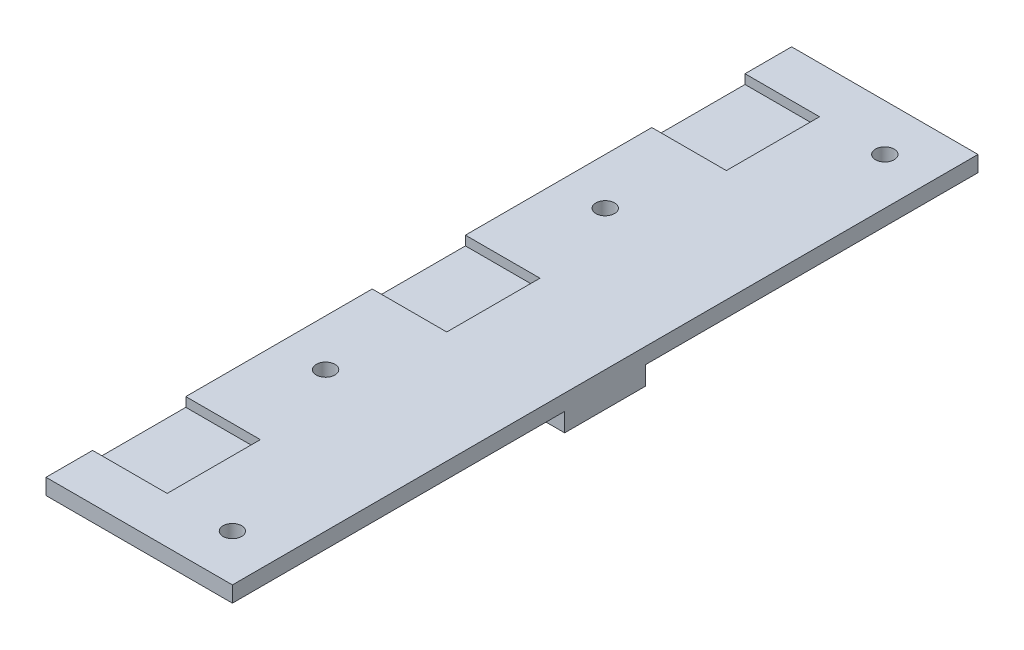
ISO-10303-21;
HEADER;
FILE_DESCRIPTION(('STEP AP214'),'2;1');
FILE_NAME('part.step','',(''),(''),'','','');
FILE_SCHEMA(('AUTOMOTIVE_DESIGN { 1 0 10303 214 1 1 1 1 }'));
ENDSEC;
DATA;
#1=APPLICATION_CONTEXT('core data for automotive mechanical design processes');
#2=APPLICATION_PROTOCOL_DEFINITION('international standard','automotive_design',2000,#1);
#3=PRODUCT_CONTEXT('',#1,'mechanical');
#4=PRODUCT('Part','Part','',(#3));
#5=PRODUCT_RELATED_PRODUCT_CATEGORY('part','',(#4));
#6=PRODUCT_DEFINITION_FORMATION('','',#4);
#7=PRODUCT_DEFINITION_CONTEXT('part definition',#1,'design');
#8=PRODUCT_DEFINITION('design','',#6,#7);
#9=PRODUCT_DEFINITION_SHAPE('','',#8);
#10=(LENGTH_UNIT() NAMED_UNIT(*) SI_UNIT(.MILLI.,.METRE.));
#11=(NAMED_UNIT(*) PLANE_ANGLE_UNIT() SI_UNIT($,.RADIAN.));
#12=(NAMED_UNIT(*) SI_UNIT($,.STERADIAN.) SOLID_ANGLE_UNIT());
#13=UNCERTAINTY_MEASURE_WITH_UNIT(LENGTH_MEASURE(1.E-05),#10,'distance_accuracy_value','');
#14=(GEOMETRIC_REPRESENTATION_CONTEXT(3) GLOBAL_UNCERTAINTY_ASSIGNED_CONTEXT((#13)) GLOBAL_UNIT_ASSIGNED_CONTEXT((#10,
#11,#12)) REPRESENTATION_CONTEXT('',''));
#15=CARTESIAN_POINT('',(0.,0.,0.));
#16=DIRECTION('',(0.,0.,1.));
#17=DIRECTION('',(1.,0.,0.));
#18=AXIS2_PLACEMENT_3D('',#15,#16,#17);
#19=CARTESIAN_POINT('',(0.,1.7,0.));
#20=DIRECTION('',(0.,-1.,0.));
#21=DIRECTION('',(0.,0.,-1.));
#22=AXIS2_PLACEMENT_3D('',#19,#20,#21);
#23=PLANE('',#22);
#24=DIRECTION('',(0.,0.,1.));
#25=VECTOR('',#24,1.);
#26=CARTESIAN_POINT('',(-10.,1.7,40.));
#27=LINE('',#26,#25);
#28=CARTESIAN_POINT('',(-10.,1.7,4.99999999999997));
#29=VERTEX_POINT('',#28);
#30=CARTESIAN_POINT('',(-10.,1.7,25.));
#31=VERTEX_POINT('',#30);
#32=EDGE_CURVE('E360',#29,#31,#27,.T.);
#33=ORIENTED_EDGE('',*,*,#32,.T.);
#34=DIRECTION('',(-1.,0.,0.));
#35=VECTOR('',#34,1.);
#36=CARTESIAN_POINT('',(-10.,1.7,25.));
#37=LINE('',#36,#35);
#38=CARTESIAN_POINT('',(-2.,1.7,25.));
#39=VERTEX_POINT('',#38);
#40=EDGE_CURVE('E212',#39,#31,#37,.T.);
#41=ORIENTED_EDGE('',*,*,#40,.F.);
#42=DIRECTION('',(0.,0.,-1.));
#43=VECTOR('',#42,1.);
#44=CARTESIAN_POINT('',(-2.,1.7,25.));
#45=LINE('',#44,#43);
#46=CARTESIAN_POINT('',(-2.,1.7,35.));
#47=VERTEX_POINT('',#46);
#48=EDGE_CURVE('E224',#47,#39,#45,.T.);
#49=ORIENTED_EDGE('',*,*,#48,.F.);
#50=DIRECTION('',(1.,0.,0.));
#51=VECTOR('',#50,1.);
#52=CARTESIAN_POINT('',(-10.,1.7,35.));
#53=LINE('',#52,#51);
#54=CARTESIAN_POINT('',(-10.,1.7,35.));
#55=VERTEX_POINT('',#54);
#56=EDGE_CURVE('E221',#55,#47,#53,.T.);
#57=ORIENTED_EDGE('',*,*,#56,.F.);
#58=CARTESIAN_POINT('',(-10.,1.7,40.));
#59=VERTEX_POINT('',#58);
#60=EDGE_CURVE('E318',#55,#59,#27,.T.);
#61=ORIENTED_EDGE('',*,*,#60,.T.);
#62=DIRECTION('',(1.,0.,0.));
#63=VECTOR('',#62,1.);
#64=CARTESIAN_POINT('',(-10.,1.7,40.));
#65=LINE('',#64,#63);
#66=CARTESIAN_POINT('',(9.99999999999999,1.7,40.));
#67=VERTEX_POINT('',#66);
#68=EDGE_CURVE('E322',#59,#67,#65,.T.);
#69=ORIENTED_EDGE('',*,*,#68,.T.);
#70=DIRECTION('',(0.,0.,-1.));
#71=VECTOR('',#70,1.);
#72=CARTESIAN_POINT('',(9.99999999999999,1.7,40.));
#73=LINE('',#72,#71);
#74=CARTESIAN_POINT('',(9.99999999999999,1.7,-40.));
#75=VERTEX_POINT('',#74);
#76=EDGE_CURVE('E312',#67,#75,#73,.T.);
#77=ORIENTED_EDGE('',*,*,#76,.T.);
#78=DIRECTION('',(-1.,0.,0.));
#79=VECTOR('',#78,1.);
#80=CARTESIAN_POINT('',(-10.,1.7,-40.));
#81=LINE('',#80,#79);
#82=CARTESIAN_POINT('',(-10.,1.7,-40.));
#83=VERTEX_POINT('',#82);
#84=EDGE_CURVE('E315',#75,#83,#81,.T.);
#85=ORIENTED_EDGE('',*,*,#84,.T.);
#86=CARTESIAN_POINT('',(-10.,1.7,-35.));
#87=VERTEX_POINT('',#86);
#88=EDGE_CURVE('E319',#83,#87,#27,.T.);
#89=ORIENTED_EDGE('',*,*,#88,.T.);
#90=DIRECTION('',(-1.,0.,0.));
#91=VECTOR('',#90,1.);
#92=CARTESIAN_POINT('',(-10.,1.7,-35.));
#93=LINE('',#92,#91);
#94=CARTESIAN_POINT('',(-2.00000000000001,1.7,-35.));
#95=VERTEX_POINT('',#94);
#96=EDGE_CURVE('E272',#95,#87,#93,.T.);
#97=ORIENTED_EDGE('',*,*,#96,.F.);
#98=DIRECTION('',(0.,0.,-1.));
#99=VECTOR('',#98,1.);
#100=CARTESIAN_POINT('',(-2.00000000000001,1.7,-35.));
#101=LINE('',#100,#99);
#102=CARTESIAN_POINT('',(-2.00000000000001,1.7,-25.));
#103=VERTEX_POINT('',#102);
#104=EDGE_CURVE('E274',#103,#95,#101,.T.);
#105=ORIENTED_EDGE('',*,*,#104,.F.);
#106=DIRECTION('',(1.,0.,0.));
#107=VECTOR('',#106,1.);
#108=CARTESIAN_POINT('',(-10.,1.7,-25.));
#109=LINE('',#108,#107);
#110=CARTESIAN_POINT('',(-10.,1.7,-25.));
#111=VERTEX_POINT('',#110);
#112=EDGE_CURVE('E248',#111,#103,#109,.T.);
#113=ORIENTED_EDGE('',*,*,#112,.F.);
#114=CARTESIAN_POINT('',(-10.,1.7,-5.00000000000002));
#115=VERTEX_POINT('',#114);
#116=EDGE_CURVE('E323',#111,#115,#27,.T.);
#117=ORIENTED_EDGE('',*,*,#116,.T.);
#118=DIRECTION('',(-1.,0.,0.));
#119=VECTOR('',#118,1.);
#120=CARTESIAN_POINT('',(-10.,1.7,-5.00000000000002));
#121=LINE('',#120,#119);
#122=CARTESIAN_POINT('',(-2.,1.7,-5.00000000000002));
#123=VERTEX_POINT('',#122);
#124=EDGE_CURVE('E249',#123,#115,#121,.T.);
#125=ORIENTED_EDGE('',*,*,#124,.F.);
#126=DIRECTION('',(0.,0.,-1.));
#127=VECTOR('',#126,1.);
#128=CARTESIAN_POINT('',(-2.,1.7,-5.00000000000002));
#129=LINE('',#128,#127);
#130=CARTESIAN_POINT('',(-2.,1.7,4.99999999999997));
#131=VERTEX_POINT('',#130);
#132=EDGE_CURVE('E251',#131,#123,#129,.T.);
#133=ORIENTED_EDGE('',*,*,#132,.F.);
#134=DIRECTION('',(1.,0.,0.));
#135=VECTOR('',#134,1.);
#136=CARTESIAN_POINT('',(-10.,1.7,4.99999999999997));
#137=LINE('',#136,#135);
#138=EDGE_CURVE('E225',#29,#131,#137,.T.);
#139=ORIENTED_EDGE('',*,*,#138,.F.);
#140=EDGE_LOOP('',(#33,#41,#49,#57,#61,#69,#77,#85,#89,#97,#105,#113,#117,#125,#133,#139));
#141=FACE_BOUND('',#140,.T.);
#142=CARTESIAN_POINT('',(-5.,1.7,-15.));
#143=DIRECTION('',(0.,1.,0.));
#144=DIRECTION('',(0.,0.,1.));
#145=AXIS2_PLACEMENT_3D('',#142,#143,#144);
#146=CIRCLE('',#145,0.999999999999998);
#147=CARTESIAN_POINT('',(-5.,1.7,-14.));
#148=VERTEX_POINT('',#147);
#149=EDGE_CURVE('E307',#148,#148,#146,.T.);
#150=ORIENTED_EDGE('',*,*,#149,.F.);
#151=EDGE_LOOP('',(#150));
#152=FACE_BOUND('',#151,.T.);
#153=CARTESIAN_POINT('',(-5.,1.7,15.));
#154=DIRECTION('',(0.,1.,0.));
#155=DIRECTION('',(0.,0.,1.));
#156=AXIS2_PLACEMENT_3D('',#153,#154,#155);
#157=CIRCLE('',#156,0.999999999999998);
#158=CARTESIAN_POINT('',(-5.,1.7,16.));
#159=VERTEX_POINT('',#158);
#160=EDGE_CURVE('E301',#159,#159,#157,.T.);
#161=ORIENTED_EDGE('',*,*,#160,.F.);
#162=EDGE_LOOP('',(#161));
#163=FACE_BOUND('',#162,.T.);
#164=CARTESIAN_POINT('',(5.,1.7,-35.));
#165=DIRECTION('',(0.,1.,0.));
#166=DIRECTION('',(0.,0.,1.));
#167=AXIS2_PLACEMENT_3D('',#164,#165,#166);
#168=CIRCLE('',#167,0.999999999999998);
#169=CARTESIAN_POINT('',(5.,1.7,-34.));
#170=VERTEX_POINT('',#169);
#171=EDGE_CURVE('E295',#170,#170,#168,.T.);
#172=ORIENTED_EDGE('',*,*,#171,.F.);
#173=EDGE_LOOP('',(#172));
#174=FACE_BOUND('',#173,.T.);
#175=CARTESIAN_POINT('',(5.,1.7,35.));
#176=DIRECTION('',(0.,1.,0.));
#177=DIRECTION('',(0.,0.,1.));
#178=AXIS2_PLACEMENT_3D('',#175,#176,#177);
#179=CIRCLE('',#178,0.999999999999998);
#180=CARTESIAN_POINT('',(5.,1.7,36.));
#181=VERTEX_POINT('',#180);
#182=EDGE_CURVE('E289',#181,#181,#179,.T.);
#183=ORIENTED_EDGE('',*,*,#182,.F.);
#184=EDGE_LOOP('',(#183));
#185=FACE_BOUND('',#184,.T.);
#186=ADVANCED_FACE('F39',(#141,#152,#163,#174,#185),#23,.F.);
#187=CARTESIAN_POINT('',(0.,0.,0.));
#188=DIRECTION('',(0.,-1.,0.));
#189=DIRECTION('',(0.,0.,-1.));
#190=AXIS2_PLACEMENT_3D('',#187,#188,#189);
#191=PLANE('',#190);
#192=DIRECTION('',(1.,0.,0.));
#193=VECTOR('',#192,1.);
#194=CARTESIAN_POINT('',(9.99999999999999,0.,-4.35));
#195=LINE('',#194,#193);
#196=CARTESIAN_POINT('',(4.59999999999999,0.,-4.35));
#197=VERTEX_POINT('',#196);
#198=CARTESIAN_POINT('',(9.99999999999999,0.,-4.35));
#199=VERTEX_POINT('',#198);
#200=EDGE_CURVE('E54',#197,#199,#195,.T.);
#201=ORIENTED_EDGE('',*,*,#200,.F.);
#202=DIRECTION('',(0.,0.,-1.));
#203=VECTOR('',#202,1.);
#204=CARTESIAN_POINT('',(4.59999999999999,0.,-4.35));
#205=LINE('',#204,#203);
#206=CARTESIAN_POINT('',(4.59999999999999,0.,4.35));
#207=VERTEX_POINT('',#206);
#208=EDGE_CURVE('E667',#207,#197,#205,.T.);
#209=ORIENTED_EDGE('',*,*,#208,.F.);
#210=DIRECTION('',(-1.,0.,0.));
#211=VECTOR('',#210,1.);
#212=CARTESIAN_POINT('',(9.99999999999999,0.,4.35));
#213=LINE('',#212,#211);
#214=CARTESIAN_POINT('',(9.99999999999999,0.,4.35));
#215=VERTEX_POINT('',#214);
#216=EDGE_CURVE('E673',#215,#207,#213,.T.);
#217=ORIENTED_EDGE('',*,*,#216,.F.);
#218=DIRECTION('',(0.,0.,-1.));
#219=VECTOR('',#218,1.);
#220=CARTESIAN_POINT('',(9.99999999999999,0.,40.));
#221=LINE('',#220,#219);
#222=CARTESIAN_POINT('',(9.99999999999999,0.,40.));
#223=VERTEX_POINT('',#222);
#224=EDGE_CURVE('E198',#223,#215,#221,.T.);
#225=ORIENTED_EDGE('',*,*,#224,.F.);
#226=DIRECTION('',(1.,0.,0.));
#227=VECTOR('',#226,1.);
#228=CARTESIAN_POINT('',(-10.,0.,40.));
#229=LINE('',#228,#227);
#230=CARTESIAN_POINT('',(-10.,0.,40.));
#231=VERTEX_POINT('',#230);
#232=EDGE_CURVE('E316',#231,#223,#229,.T.);
#233=ORIENTED_EDGE('',*,*,#232,.F.);
#234=DIRECTION('',(0.,0.,1.));
#235=VECTOR('',#234,1.);
#236=CARTESIAN_POINT('',(-10.,0.,40.));
#237=LINE('',#236,#235);
#238=CARTESIAN_POINT('',(-10.,0.,-40.));
#239=VERTEX_POINT('',#238);
#240=EDGE_CURVE('E329',#239,#231,#237,.T.);
#241=ORIENTED_EDGE('',*,*,#240,.F.);
#242=DIRECTION('',(-1.,0.,0.));
#243=VECTOR('',#242,1.);
#244=CARTESIAN_POINT('',(-10.,0.,-40.));
#245=LINE('',#244,#243);
#246=CARTESIAN_POINT('',(9.99999999999999,0.,-40.));
#247=VERTEX_POINT('',#246);
#248=EDGE_CURVE('E327',#247,#239,#245,.T.);
#249=ORIENTED_EDGE('',*,*,#248,.F.);
#250=EDGE_CURVE('E59',#199,#247,#221,.T.);
#251=ORIENTED_EDGE('',*,*,#250,.F.);
#252=EDGE_LOOP('',(#201,#209,#217,#225,#233,#241,#249,#251));
#253=FACE_BOUND('',#252,.T.);
#254=CARTESIAN_POINT('',(5.,0.,-35.));
#255=DIRECTION('',(0.,1.,0.));
#256=DIRECTION('',(0.,0.,1.));
#257=AXIS2_PLACEMENT_3D('',#254,#255,#256);
#258=CIRCLE('',#257,0.999999999999998);
#259=CARTESIAN_POINT('',(5.,0.,-34.));
#260=VERTEX_POINT('',#259);
#261=EDGE_CURVE('E292',#260,#260,#258,.T.);
#262=ORIENTED_EDGE('',*,*,#261,.T.);
#263=EDGE_LOOP('',(#262));
#264=FACE_BOUND('',#263,.T.);
#265=CARTESIAN_POINT('',(-5.,0.,-15.));
#266=DIRECTION('',(0.,1.,0.));
#267=DIRECTION('',(0.,0.,1.));
#268=AXIS2_PLACEMENT_3D('',#265,#266,#267);
#269=CIRCLE('',#268,0.999999999999998);
#270=CARTESIAN_POINT('',(-5.,0.,-14.));
#271=VERTEX_POINT('',#270);
#272=EDGE_CURVE('E304',#271,#271,#269,.T.);
#273=ORIENTED_EDGE('',*,*,#272,.T.);
#274=EDGE_LOOP('',(#273));
#275=FACE_BOUND('',#274,.T.);
#276=CARTESIAN_POINT('',(-5.,0.,15.));
#277=DIRECTION('',(0.,1.,0.));
#278=DIRECTION('',(0.,0.,1.));
#279=AXIS2_PLACEMENT_3D('',#276,#277,#278);
#280=CIRCLE('',#279,0.999999999999998);
#281=CARTESIAN_POINT('',(-5.,0.,16.));
#282=VERTEX_POINT('',#281);
#283=EDGE_CURVE('E298',#282,#282,#280,.T.);
#284=ORIENTED_EDGE('',*,*,#283,.T.);
#285=EDGE_LOOP('',(#284));
#286=FACE_BOUND('',#285,.T.);
#287=CARTESIAN_POINT('',(5.,0.,35.));
#288=DIRECTION('',(0.,1.,0.));
#289=DIRECTION('',(0.,0.,1.));
#290=AXIS2_PLACEMENT_3D('',#287,#288,#289);
#291=CIRCLE('',#290,0.999999999999998);
#292=CARTESIAN_POINT('',(5.,0.,36.));
#293=VERTEX_POINT('',#292);
#294=EDGE_CURVE('E232',#293,#293,#291,.T.);
#295=ORIENTED_EDGE('',*,*,#294,.T.);
#296=EDGE_LOOP('',(#295));
#297=FACE_BOUND('',#296,.T.);
#298=ADVANCED_FACE('F345',(#253,#264,#275,#286,#297),#191,.T.);
#299=CARTESIAN_POINT('',(9.99999999999999,1.7,40.));
#300=DIRECTION('',(-1.,0.,0.));
#301=DIRECTION('',(0.,0.,1.));
#302=AXIS2_PLACEMENT_3D('',#299,#300,#301);
#303=PLANE('',#302);
#304=ORIENTED_EDGE('',*,*,#224,.T.);
#305=DIRECTION('',(0.,1.,0.));
#306=VECTOR('',#305,1.);
#307=CARTESIAN_POINT('',(9.99999999999999,-2.,4.35));
#308=LINE('',#307,#306);
#309=CARTESIAN_POINT('',(9.99999999999999,-2.,4.35));
#310=VERTEX_POINT('',#309);
#311=EDGE_CURVE('E179',#310,#215,#308,.T.);
#312=ORIENTED_EDGE('',*,*,#311,.F.);
#313=DIRECTION('',(0.,0.,1.));
#314=VECTOR('',#313,1.);
#315=CARTESIAN_POINT('',(9.99999999999999,-2.,-4.35));
#316=LINE('',#315,#314);
#317=CARTESIAN_POINT('',(9.99999999999999,-2.,-4.35));
#318=VERTEX_POINT('',#317);
#319=EDGE_CURVE('E185',#318,#310,#316,.T.);
#320=ORIENTED_EDGE('',*,*,#319,.F.);
#321=DIRECTION('',(0.,1.,0.));
#322=VECTOR('',#321,1.);
#323=CARTESIAN_POINT('',(9.99999999999999,-2.,-4.35));
#324=LINE('',#323,#322);
#325=EDGE_CURVE('E665',#318,#199,#324,.T.);
#326=ORIENTED_EDGE('',*,*,#325,.T.);
#327=ORIENTED_EDGE('',*,*,#250,.T.);
#328=DIRECTION('',(0.,-1.,0.));
#329=VECTOR('',#328,1.);
#330=CARTESIAN_POINT('',(9.99999999999999,1.7,-40.));
#331=LINE('',#330,#329);
#332=EDGE_CURVE('E11',#75,#247,#331,.T.);
#333=ORIENTED_EDGE('',*,*,#332,.F.);
#334=ORIENTED_EDGE('',*,*,#76,.F.);
#335=DIRECTION('',(0.,-1.,0.));
#336=VECTOR('',#335,1.);
#337=CARTESIAN_POINT('',(9.99999999999999,1.7,40.));
#338=LINE('',#337,#336);
#339=EDGE_CURVE('E325',#67,#223,#338,.T.);
#340=ORIENTED_EDGE('',*,*,#339,.T.);
#341=EDGE_LOOP('',(#304,#312,#320,#326,#327,#333,#334,#340));
#342=FACE_BOUND('',#341,.T.);
#343=ADVANCED_FACE('F41',(#342),#303,.F.);
#344=CARTESIAN_POINT('',(-10.,1.7,-40.));
#345=DIRECTION('',(0.,0.,1.));
#346=DIRECTION('',(1.,0.,0.));
#347=AXIS2_PLACEMENT_3D('',#344,#345,#346);
#348=PLANE('',#347);
#349=ORIENTED_EDGE('',*,*,#248,.T.);
#350=DIRECTION('',(0.,-1.,0.));
#351=VECTOR('',#350,1.);
#352=CARTESIAN_POINT('',(-10.,1.7,-40.));
#353=LINE('',#352,#351);
#354=EDGE_CURVE('E47',#83,#239,#353,.T.);
#355=ORIENTED_EDGE('',*,*,#354,.F.);
#356=ORIENTED_EDGE('',*,*,#84,.F.);
#357=ORIENTED_EDGE('',*,*,#332,.T.);
#358=EDGE_LOOP('',(#349,#355,#356,#357));
#359=FACE_BOUND('',#358,.T.);
#360=ADVANCED_FACE('F417',(#359),#348,.F.);
#361=CARTESIAN_POINT('',(-10.,1.7,40.));
#362=DIRECTION('',(1.,0.,0.));
#363=DIRECTION('',(0.,0.,-1.));
#364=AXIS2_PLACEMENT_3D('',#361,#362,#363);
#365=PLANE('',#364);
#366=DIRECTION('',(0.,0.,1.));
#367=VECTOR('',#366,1.);
#368=CARTESIAN_POINT('',(-10.,0.7,25.));
#369=LINE('',#368,#367);
#370=CARTESIAN_POINT('',(-10.,0.7,25.));
#371=VERTEX_POINT('',#370);
#372=CARTESIAN_POINT('',(-10.,0.7,35.));
#373=VERTEX_POINT('',#372);
#374=EDGE_CURVE('E208',#371,#373,#369,.T.);
#375=ORIENTED_EDGE('',*,*,#374,.F.);
#376=DIRECTION('',(0.,1.,0.));
#377=VECTOR('',#376,1.);
#378=CARTESIAN_POINT('',(-10.,0.7,25.));
#379=LINE('',#378,#377);
#380=EDGE_CURVE('E229',#371,#31,#379,.T.);
#381=ORIENTED_EDGE('',*,*,#380,.T.);
#382=ORIENTED_EDGE('',*,*,#32,.F.);
#383=DIRECTION('',(0.,1.,0.));
#384=VECTOR('',#383,1.);
#385=CARTESIAN_POINT('',(-10.,0.7,4.99999999999997));
#386=LINE('',#385,#384);
#387=CARTESIAN_POINT('',(-10.,0.7,4.99999999999997));
#388=VERTEX_POINT('',#387);
#389=EDGE_CURVE('E238',#388,#29,#386,.T.);
#390=ORIENTED_EDGE('',*,*,#389,.F.);
#391=DIRECTION('',(0.,0.,1.));
#392=VECTOR('',#391,1.);
#393=CARTESIAN_POINT('',(-10.,0.7,-5.00000000000002));
#394=LINE('',#393,#392);
#395=CARTESIAN_POINT('',(-10.,0.7,-5.00000000000002));
#396=VERTEX_POINT('',#395);
#397=EDGE_CURVE('E252',#396,#388,#394,.T.);
#398=ORIENTED_EDGE('',*,*,#397,.F.);
#399=DIRECTION('',(0.,1.,0.));
#400=VECTOR('',#399,1.);
#401=CARTESIAN_POINT('',(-10.,0.7,-5.00000000000002));
#402=LINE('',#401,#400);
#403=EDGE_CURVE('E245',#396,#115,#402,.T.);
#404=ORIENTED_EDGE('',*,*,#403,.T.);
#405=ORIENTED_EDGE('',*,*,#116,.F.);
#406=DIRECTION('',(0.,1.,0.));
#407=VECTOR('',#406,1.);
#408=CARTESIAN_POINT('',(-10.,0.7,-25.));
#409=LINE('',#408,#407);
#410=CARTESIAN_POINT('',(-10.,0.7,-25.));
#411=VERTEX_POINT('',#410);
#412=EDGE_CURVE('E266',#411,#111,#409,.T.);
#413=ORIENTED_EDGE('',*,*,#412,.F.);
#414=DIRECTION('',(0.,0.,1.));
#415=VECTOR('',#414,1.);
#416=CARTESIAN_POINT('',(-10.,0.7,-35.));
#417=LINE('',#416,#415);
#418=CARTESIAN_POINT('',(-10.,0.7,-35.));
#419=VERTEX_POINT('',#418);
#420=EDGE_CURVE('E275',#419,#411,#417,.T.);
#421=ORIENTED_EDGE('',*,*,#420,.F.);
#422=DIRECTION('',(0.,1.,0.));
#423=VECTOR('',#422,1.);
#424=CARTESIAN_POINT('',(-10.,0.7,-35.));
#425=LINE('',#424,#423);
#426=EDGE_CURVE('E199',#419,#87,#425,.T.);
#427=ORIENTED_EDGE('',*,*,#426,.T.);
#428=ORIENTED_EDGE('',*,*,#88,.F.);
#429=ORIENTED_EDGE('',*,*,#354,.T.);
#430=ORIENTED_EDGE('',*,*,#240,.T.);
#431=DIRECTION('',(0.,-1.,0.));
#432=VECTOR('',#431,1.);
#433=CARTESIAN_POINT('',(-10.,1.7,40.));
#434=LINE('',#433,#432);
#435=EDGE_CURVE('E333',#59,#231,#434,.T.);
#436=ORIENTED_EDGE('',*,*,#435,.F.);
#437=ORIENTED_EDGE('',*,*,#60,.F.);
#438=DIRECTION('',(0.,1.,0.));
#439=VECTOR('',#438,1.);
#440=CARTESIAN_POINT('',(-10.,0.7,35.));
#441=LINE('',#440,#439);
#442=EDGE_CURVE('E220',#373,#55,#441,.T.);
#443=ORIENTED_EDGE('',*,*,#442,.F.);
#444=EDGE_LOOP('',(#375,#381,#382,#390,#398,#404,#405,#413,#421,#427,#428,#429,#430,#436,#437,#443));
#445=FACE_BOUND('',#444,.T.);
#446=ADVANCED_FACE('F341',(#445),#365,.F.);
#447=CARTESIAN_POINT('',(-10.,1.7,40.));
#448=DIRECTION('',(0.,0.,-1.));
#449=DIRECTION('',(-1.,0.,0.));
#450=AXIS2_PLACEMENT_3D('',#447,#448,#449);
#451=PLANE('',#450);
#452=ORIENTED_EDGE('',*,*,#232,.T.);
#453=ORIENTED_EDGE('',*,*,#339,.F.);
#454=ORIENTED_EDGE('',*,*,#68,.F.);
#455=ORIENTED_EDGE('',*,*,#435,.T.);
#456=EDGE_LOOP('',(#452,#453,#454,#455));
#457=FACE_BOUND('',#456,.T.);
#458=ADVANCED_FACE('F349',(#457),#451,.F.);
#459=CARTESIAN_POINT('',(-5.,1.7,-15.));
#460=DIRECTION('',(0.,-1.,0.));
#461=DIRECTION('',(0.,0.,-1.));
#462=AXIS2_PLACEMENT_3D('',#459,#460,#461);
#463=CYLINDRICAL_SURFACE('',#462,0.999999999999998);
#464=ORIENTED_EDGE('',*,*,#149,.T.);
#465=EDGE_LOOP('',(#464));
#466=FACE_BOUND('',#465,.T.);
#467=ORIENTED_EDGE('',*,*,#272,.F.);
#468=EDGE_LOOP('',(#467));
#469=FACE_BOUND('',#468,.T.);
#470=ADVANCED_FACE('F412',(#466,#469),#463,.F.);
#471=CARTESIAN_POINT('',(-5.,1.7,15.));
#472=DIRECTION('',(0.,-1.,0.));
#473=DIRECTION('',(0.,0.,-1.));
#474=AXIS2_PLACEMENT_3D('',#471,#472,#473);
#475=CYLINDRICAL_SURFACE('',#474,0.999999999999998);
#476=ORIENTED_EDGE('',*,*,#160,.T.);
#477=EDGE_LOOP('',(#476));
#478=FACE_BOUND('',#477,.T.);
#479=ORIENTED_EDGE('',*,*,#283,.F.);
#480=EDGE_LOOP('',(#479));
#481=FACE_BOUND('',#480,.T.);
#482=ADVANCED_FACE('F554',(#478,#481),#475,.F.);
#483=CARTESIAN_POINT('',(5.,1.7,-35.));
#484=DIRECTION('',(0.,-1.,0.));
#485=DIRECTION('',(0.,0.,-1.));
#486=AXIS2_PLACEMENT_3D('',#483,#484,#485);
#487=CYLINDRICAL_SURFACE('',#486,0.999999999999998);
#488=ORIENTED_EDGE('',*,*,#171,.T.);
#489=EDGE_LOOP('',(#488));
#490=FACE_BOUND('',#489,.T.);
#491=ORIENTED_EDGE('',*,*,#261,.F.);
#492=EDGE_LOOP('',(#491));
#493=FACE_BOUND('',#492,.T.);
#494=ADVANCED_FACE('F563',(#490,#493),#487,.F.);
#495=CARTESIAN_POINT('',(5.,1.7,35.));
#496=DIRECTION('',(0.,-1.,0.));
#497=DIRECTION('',(0.,0.,-1.));
#498=AXIS2_PLACEMENT_3D('',#495,#496,#497);
#499=CYLINDRICAL_SURFACE('',#498,0.999999999999998);
#500=ORIENTED_EDGE('',*,*,#182,.T.);
#501=EDGE_LOOP('',(#500));
#502=FACE_BOUND('',#501,.T.);
#503=ORIENTED_EDGE('',*,*,#294,.F.);
#504=EDGE_LOOP('',(#503));
#505=FACE_BOUND('',#504,.T.);
#506=ADVANCED_FACE('F431',(#502,#505),#499,.F.);
#507=CARTESIAN_POINT('',(-10.,0.7,-35.));
#508=DIRECTION('',(0.,0.,-1.));
#509=DIRECTION('',(-1.,0.,0.));
#510=AXIS2_PLACEMENT_3D('',#507,#508,#509);
#511=PLANE('',#510);
#512=ORIENTED_EDGE('',*,*,#96,.T.);
#513=ORIENTED_EDGE('',*,*,#426,.F.);
#514=DIRECTION('',(-1.,0.,0.));
#515=VECTOR('',#514,1.);
#516=CARTESIAN_POINT('',(-10.,0.7,-35.));
#517=LINE('',#516,#515);
#518=CARTESIAN_POINT('',(-2.00000000000001,0.7,-35.));
#519=VERTEX_POINT('',#518);
#520=EDGE_CURVE('E268',#519,#419,#517,.T.);
#521=ORIENTED_EDGE('',*,*,#520,.F.);
#522=DIRECTION('',(0.,1.,0.));
#523=VECTOR('',#522,1.);
#524=CARTESIAN_POINT('',(-2.00000000000001,0.7,-35.));
#525=LINE('',#524,#523);
#526=EDGE_CURVE('E202',#519,#95,#525,.T.);
#527=ORIENTED_EDGE('',*,*,#526,.T.);
#528=EDGE_LOOP('',(#512,#513,#521,#527));
#529=FACE_BOUND('',#528,.T.);
#530=ADVANCED_FACE('F434',(#529),#511,.F.);
#531=CARTESIAN_POINT('',(-2.00000000000001,0.7,-35.));
#532=DIRECTION('',(1.,0.,0.));
#533=DIRECTION('',(0.,0.,-1.));
#534=AXIS2_PLACEMENT_3D('',#531,#532,#533);
#535=PLANE('',#534);
#536=ORIENTED_EDGE('',*,*,#104,.T.);
#537=ORIENTED_EDGE('',*,*,#526,.F.);
#538=DIRECTION('',(0.,0.,-1.));
#539=VECTOR('',#538,1.);
#540=CARTESIAN_POINT('',(-2.00000000000001,0.7,-35.));
#541=LINE('',#540,#539);
#542=CARTESIAN_POINT('',(-2.00000000000001,0.7,-25.));
#543=VERTEX_POINT('',#542);
#544=EDGE_CURVE('E281',#543,#519,#541,.T.);
#545=ORIENTED_EDGE('',*,*,#544,.F.);
#546=DIRECTION('',(0.,1.,0.));
#547=VECTOR('',#546,1.);
#548=CARTESIAN_POINT('',(-2.00000000000001,0.7,-25.));
#549=LINE('',#548,#547);
#550=EDGE_CURVE('E269',#543,#103,#549,.T.);
#551=ORIENTED_EDGE('',*,*,#550,.T.);
#552=EDGE_LOOP('',(#536,#537,#545,#551));
#553=FACE_BOUND('',#552,.T.);
#554=ADVANCED_FACE('F438',(#553),#535,.F.);
#555=CARTESIAN_POINT('',(-10.,0.7,-25.));
#556=DIRECTION('',(0.,0.,1.));
#557=DIRECTION('',(1.,0.,0.));
#558=AXIS2_PLACEMENT_3D('',#555,#556,#557);
#559=PLANE('',#558);
#560=ORIENTED_EDGE('',*,*,#112,.T.);
#561=ORIENTED_EDGE('',*,*,#550,.F.);
#562=DIRECTION('',(1.,0.,0.));
#563=VECTOR('',#562,1.);
#564=CARTESIAN_POINT('',(-10.,0.7,-25.));
#565=LINE('',#564,#563);
#566=EDGE_CURVE('E284',#411,#543,#565,.T.);
#567=ORIENTED_EDGE('',*,*,#566,.F.);
#568=ORIENTED_EDGE('',*,*,#412,.T.);
#569=EDGE_LOOP('',(#560,#561,#567,#568));
#570=FACE_BOUND('',#569,.T.);
#571=ADVANCED_FACE('F446',(#570),#559,.F.);
#572=CARTESIAN_POINT('',(0.,0.7,0.));
#573=DIRECTION('',(0.,1.,0.));
#574=DIRECTION('',(0.,0.,1.));
#575=AXIS2_PLACEMENT_3D('',#572,#573,#574);
#576=PLANE('',#575);
#577=ORIENTED_EDGE('',*,*,#420,.T.);
#578=ORIENTED_EDGE('',*,*,#566,.T.);
#579=ORIENTED_EDGE('',*,*,#544,.T.);
#580=ORIENTED_EDGE('',*,*,#520,.T.);
#581=EDGE_LOOP('',(#577,#578,#579,#580));
#582=FACE_BOUND('',#581,.T.);
#583=ADVANCED_FACE('F454',(#582),#576,.T.);
#584=CARTESIAN_POINT('',(-10.,0.7,-5.00000000000002));
#585=DIRECTION('',(0.,0.,-1.));
#586=DIRECTION('',(-1.,0.,0.));
#587=AXIS2_PLACEMENT_3D('',#584,#585,#586);
#588=PLANE('',#587);
#589=ORIENTED_EDGE('',*,*,#124,.T.);
#590=ORIENTED_EDGE('',*,*,#403,.F.);
#591=DIRECTION('',(-1.,0.,0.));
#592=VECTOR('',#591,1.);
#593=CARTESIAN_POINT('',(-10.,0.7,-5.00000000000002));
#594=LINE('',#593,#592);
#595=CARTESIAN_POINT('',(-2.,0.7,-5.00000000000002));
#596=VERTEX_POINT('',#595);
#597=EDGE_CURVE('E240',#596,#396,#594,.T.);
#598=ORIENTED_EDGE('',*,*,#597,.F.);
#599=DIRECTION('',(0.,1.,0.));
#600=VECTOR('',#599,1.);
#601=CARTESIAN_POINT('',(-2.,0.7,-5.00000000000002));
#602=LINE('',#601,#600);
#603=EDGE_CURVE('E243',#596,#123,#602,.T.);
#604=ORIENTED_EDGE('',*,*,#603,.T.);
#605=EDGE_LOOP('',(#589,#590,#598,#604));
#606=FACE_BOUND('',#605,.T.);
#607=ADVANCED_FACE('F377',(#606),#588,.F.);
#608=CARTESIAN_POINT('',(-2.,0.7,-5.00000000000002));
#609=DIRECTION('',(1.,0.,0.));
#610=DIRECTION('',(0.,0.,-1.));
#611=AXIS2_PLACEMENT_3D('',#608,#609,#610);
#612=PLANE('',#611);
#613=ORIENTED_EDGE('',*,*,#132,.T.);
#614=ORIENTED_EDGE('',*,*,#603,.F.);
#615=DIRECTION('',(0.,0.,-1.));
#616=VECTOR('',#615,1.);
#617=CARTESIAN_POINT('',(-2.,0.7,-5.00000000000002));
#618=LINE('',#617,#616);
#619=CARTESIAN_POINT('',(-2.,0.7,4.99999999999997));
#620=VERTEX_POINT('',#619);
#621=EDGE_CURVE('E258',#620,#596,#618,.T.);
#622=ORIENTED_EDGE('',*,*,#621,.F.);
#623=DIRECTION('',(0.,1.,0.));
#624=VECTOR('',#623,1.);
#625=CARTESIAN_POINT('',(-2.,0.7,4.99999999999997));
#626=LINE('',#625,#624);
#627=EDGE_CURVE('E241',#620,#131,#626,.T.);
#628=ORIENTED_EDGE('',*,*,#627,.T.);
#629=EDGE_LOOP('',(#613,#614,#622,#628));
#630=FACE_BOUND('',#629,.T.);
#631=ADVANCED_FACE('F380',(#630),#612,.F.);
#632=CARTESIAN_POINT('',(-10.,0.7,4.99999999999997));
#633=DIRECTION('',(0.,0.,1.));
#634=DIRECTION('',(1.,0.,0.));
#635=AXIS2_PLACEMENT_3D('',#632,#633,#634);
#636=PLANE('',#635);
#637=ORIENTED_EDGE('',*,*,#138,.T.);
#638=ORIENTED_EDGE('',*,*,#627,.F.);
#639=DIRECTION('',(1.,0.,0.));
#640=VECTOR('',#639,1.);
#641=CARTESIAN_POINT('',(-10.,0.7,4.99999999999997));
#642=LINE('',#641,#640);
#643=EDGE_CURVE('E261',#388,#620,#642,.T.);
#644=ORIENTED_EDGE('',*,*,#643,.F.);
#645=ORIENTED_EDGE('',*,*,#389,.T.);
#646=EDGE_LOOP('',(#637,#638,#644,#645));
#647=FACE_BOUND('',#646,.T.);
#648=ADVANCED_FACE('F475',(#647),#636,.F.);
#649=CARTESIAN_POINT('',(0.,0.7,0.));
#650=DIRECTION('',(0.,1.,0.));
#651=DIRECTION('',(0.,0.,1.));
#652=AXIS2_PLACEMENT_3D('',#649,#650,#651);
#653=PLANE('',#652);
#654=ORIENTED_EDGE('',*,*,#397,.T.);
#655=ORIENTED_EDGE('',*,*,#643,.T.);
#656=ORIENTED_EDGE('',*,*,#621,.T.);
#657=ORIENTED_EDGE('',*,*,#597,.T.);
#658=EDGE_LOOP('',(#654,#655,#656,#657));
#659=FACE_BOUND('',#658,.T.);
#660=ADVANCED_FACE('F482',(#659),#653,.T.);
#661=CARTESIAN_POINT('',(-10.,0.7,25.));
#662=DIRECTION('',(0.,0.,-1.));
#663=DIRECTION('',(-1.,0.,0.));
#664=AXIS2_PLACEMENT_3D('',#661,#662,#663);
#665=PLANE('',#664);
#666=ORIENTED_EDGE('',*,*,#40,.T.);
#667=ORIENTED_EDGE('',*,*,#380,.F.);
#668=DIRECTION('',(-1.,0.,0.));
#669=VECTOR('',#668,1.);
#670=CARTESIAN_POINT('',(-10.,0.7,25.));
#671=LINE('',#670,#669);
#672=CARTESIAN_POINT('',(-2.,0.7,25.));
#673=VERTEX_POINT('',#672);
#674=EDGE_CURVE('E218',#673,#371,#671,.T.);
#675=ORIENTED_EDGE('',*,*,#674,.F.);
#676=DIRECTION('',(0.,1.,0.));
#677=VECTOR('',#676,1.);
#678=CARTESIAN_POINT('',(-2.,0.7,25.));
#679=LINE('',#678,#677);
#680=EDGE_CURVE('E233',#673,#39,#679,.T.);
#681=ORIENTED_EDGE('',*,*,#680,.T.);
#682=EDGE_LOOP('',(#666,#667,#675,#681));
#683=FACE_BOUND('',#682,.T.);
#684=ADVANCED_FACE('F385',(#683),#665,.F.);
#685=CARTESIAN_POINT('',(-2.,0.7,25.));
#686=DIRECTION('',(1.,0.,0.));
#687=DIRECTION('',(0.,0.,-1.));
#688=AXIS2_PLACEMENT_3D('',#685,#686,#687);
#689=PLANE('',#688);
#690=ORIENTED_EDGE('',*,*,#48,.T.);
#691=ORIENTED_EDGE('',*,*,#680,.F.);
#692=DIRECTION('',(0.,0.,-1.));
#693=VECTOR('',#692,1.);
#694=CARTESIAN_POINT('',(-2.,0.7,25.));
#695=LINE('',#694,#693);
#696=CARTESIAN_POINT('',(-2.,0.7,35.));
#697=VERTEX_POINT('',#696);
#698=EDGE_CURVE('E215',#697,#673,#695,.T.);
#699=ORIENTED_EDGE('',*,*,#698,.F.);
#700=DIRECTION('',(0.,1.,0.));
#701=VECTOR('',#700,1.);
#702=CARTESIAN_POINT('',(-2.,0.7,35.));
#703=LINE('',#702,#701);
#704=EDGE_CURVE('E235',#697,#47,#703,.T.);
#705=ORIENTED_EDGE('',*,*,#704,.T.);
#706=EDGE_LOOP('',(#690,#691,#699,#705));
#707=FACE_BOUND('',#706,.T.);
#708=ADVANCED_FACE('F387',(#707),#689,.F.);
#709=CARTESIAN_POINT('',(-10.,0.7,35.));
#710=DIRECTION('',(0.,0.,1.));
#711=DIRECTION('',(1.,0.,0.));
#712=AXIS2_PLACEMENT_3D('',#709,#710,#711);
#713=PLANE('',#712);
#714=ORIENTED_EDGE('',*,*,#56,.T.);
#715=ORIENTED_EDGE('',*,*,#704,.F.);
#716=DIRECTION('',(1.,0.,0.));
#717=VECTOR('',#716,1.);
#718=CARTESIAN_POINT('',(-10.,0.7,35.));
#719=LINE('',#718,#717);
#720=EDGE_CURVE('E211',#373,#697,#719,.T.);
#721=ORIENTED_EDGE('',*,*,#720,.F.);
#722=ORIENTED_EDGE('',*,*,#442,.T.);
#723=EDGE_LOOP('',(#714,#715,#721,#722));
#724=FACE_BOUND('',#723,.T.);
#725=ADVANCED_FACE('F390',(#724),#713,.F.);
#726=CARTESIAN_POINT('',(0.,0.7,0.));
#727=DIRECTION('',(0.,1.,0.));
#728=DIRECTION('',(0.,0.,1.));
#729=AXIS2_PLACEMENT_3D('',#726,#727,#728);
#730=PLANE('',#729);
#731=ORIENTED_EDGE('',*,*,#374,.T.);
#732=ORIENTED_EDGE('',*,*,#720,.T.);
#733=ORIENTED_EDGE('',*,*,#698,.T.);
#734=ORIENTED_EDGE('',*,*,#674,.T.);
#735=EDGE_LOOP('',(#731,#732,#733,#734));
#736=FACE_BOUND('',#735,.T.);
#737=ADVANCED_FACE('F392',(#736),#730,.T.);
#738=CARTESIAN_POINT('',(9.99999999999999,-2.,4.35));
#739=DIRECTION('',(0.,0.,-1.));
#740=DIRECTION('',(-1.,0.,0.));
#741=AXIS2_PLACEMENT_3D('',#738,#739,#740);
#742=PLANE('',#741);
#743=ORIENTED_EDGE('',*,*,#216,.T.);
#744=DIRECTION('',(0.,1.,0.));
#745=VECTOR('',#744,1.);
#746=CARTESIAN_POINT('',(4.59999999999999,-2.,4.35));
#747=LINE('',#746,#745);
#748=CARTESIAN_POINT('',(4.59999999999999,-2.,4.35));
#749=VERTEX_POINT('',#748);
#750=EDGE_CURVE('E181',#749,#207,#747,.T.);
#751=ORIENTED_EDGE('',*,*,#750,.F.);
#752=DIRECTION('',(-1.,0.,0.));
#753=VECTOR('',#752,1.);
#754=CARTESIAN_POINT('',(9.99999999999999,-2.,4.35));
#755=LINE('',#754,#753);
#756=EDGE_CURVE('E174',#310,#749,#755,.T.);
#757=ORIENTED_EDGE('',*,*,#756,.F.);
#758=ORIENTED_EDGE('',*,*,#311,.T.);
#759=EDGE_LOOP('',(#743,#751,#757,#758));
#760=FACE_BOUND('',#759,.T.);
#761=ADVANCED_FACE('F177',(#760),#742,.F.);
#762=CARTESIAN_POINT('',(4.59999999999999,-2.,-4.35));
#763=DIRECTION('',(1.,0.,0.));
#764=DIRECTION('',(0.,0.,-1.));
#765=AXIS2_PLACEMENT_3D('',#762,#763,#764);
#766=PLANE('',#765);
#767=ORIENTED_EDGE('',*,*,#208,.T.);
#768=DIRECTION('',(0.,1.,0.));
#769=VECTOR('',#768,1.);
#770=CARTESIAN_POINT('',(4.59999999999999,-2.,-4.35));
#771=LINE('',#770,#769);
#772=CARTESIAN_POINT('',(4.59999999999999,-2.,-4.35));
#773=VERTEX_POINT('',#772);
#774=EDGE_CURVE('E204',#773,#197,#771,.T.);
#775=ORIENTED_EDGE('',*,*,#774,.F.);
#776=DIRECTION('',(0.,0.,-1.));
#777=VECTOR('',#776,1.);
#778=CARTESIAN_POINT('',(4.59999999999999,-2.,-4.35));
#779=LINE('',#778,#777);
#780=EDGE_CURVE('E184',#749,#773,#779,.T.);
#781=ORIENTED_EDGE('',*,*,#780,.F.);
#782=ORIENTED_EDGE('',*,*,#750,.T.);
#783=EDGE_LOOP('',(#767,#775,#781,#782));
#784=FACE_BOUND('',#783,.T.);
#785=ADVANCED_FACE('F399',(#784),#766,.F.);
#786=CARTESIAN_POINT('',(9.99999999999999,-2.,-4.35));
#787=DIRECTION('',(0.,0.,1.));
#788=DIRECTION('',(1.,0.,0.));
#789=AXIS2_PLACEMENT_3D('',#786,#787,#788);
#790=PLANE('',#789);
#791=ORIENTED_EDGE('',*,*,#200,.T.);
#792=ORIENTED_EDGE('',*,*,#325,.F.);
#793=DIRECTION('',(1.,0.,0.));
#794=VECTOR('',#793,1.);
#795=CARTESIAN_POINT('',(9.99999999999999,-2.,-4.35));
#796=LINE('',#795,#794);
#797=EDGE_CURVE('E190',#773,#318,#796,.T.);
#798=ORIENTED_EDGE('',*,*,#797,.F.);
#799=ORIENTED_EDGE('',*,*,#774,.T.);
#800=EDGE_LOOP('',(#791,#792,#798,#799));
#801=FACE_BOUND('',#800,.T.);
#802=ADVANCED_FACE('F634',(#801),#790,.F.);
#803=CARTESIAN_POINT('',(0.,-2.,0.));
#804=DIRECTION('',(0.,-1.,0.));
#805=DIRECTION('',(0.,0.,-1.));
#806=AXIS2_PLACEMENT_3D('',#803,#804,#805);
#807=PLANE('',#806);
#808=ORIENTED_EDGE('',*,*,#319,.T.);
#809=ORIENTED_EDGE('',*,*,#756,.T.);
#810=ORIENTED_EDGE('',*,*,#780,.T.);
#811=ORIENTED_EDGE('',*,*,#797,.T.);
#812=EDGE_LOOP('',(#808,#809,#810,#811));
#813=FACE_BOUND('',#812,.T.);
#814=ADVANCED_FACE('F188',(#813),#807,.T.);
#815=CLOSED_SHELL('',(#186,#298,#343,#360,#446,#458,#470,#482,#494,#506,#530,#554,#571,#583,
#607,#631,#648,#660,#684,#708,#725,#737,#761,#785,#802,#814));
#816=MANIFOLD_SOLID_BREP('B2',#815);
#817=ADVANCED_BREP_SHAPE_REPRESENTATION('',(#18,#816),#14);
#818=SHAPE_DEFINITION_REPRESENTATION(#9,#817);
ENDSEC;
END-ISO-10303-21;
